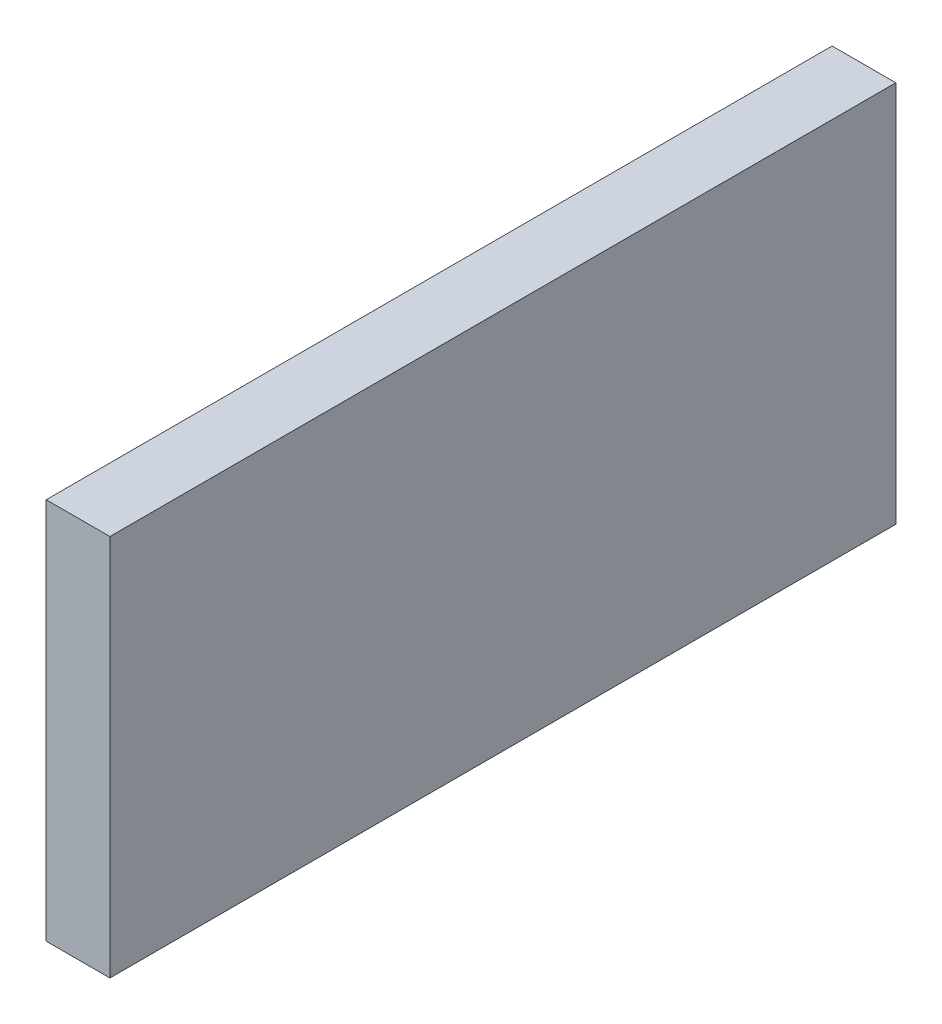
ISO-10303-21;
HEADER;
FILE_DESCRIPTION(('STEP AP214'),'2;1');
FILE_NAME('part.step','',(''),(''),'','','');
FILE_SCHEMA(('AUTOMOTIVE_DESIGN { 1 0 10303 214 1 1 1 1 }'));
ENDSEC;
DATA;
#1=APPLICATION_CONTEXT('core data for automotive mechanical design processes');
#2=APPLICATION_PROTOCOL_DEFINITION('international standard','automotive_design',2000,#1);
#3=PRODUCT_CONTEXT('',#1,'mechanical');
#4=PRODUCT('Part','Part','',(#3));
#5=PRODUCT_RELATED_PRODUCT_CATEGORY('part','',(#4));
#6=PRODUCT_DEFINITION_FORMATION('','',#4);
#7=PRODUCT_DEFINITION_CONTEXT('part definition',#1,'design');
#8=PRODUCT_DEFINITION('design','',#6,#7);
#9=PRODUCT_DEFINITION_SHAPE('','',#8);
#10=(LENGTH_UNIT() NAMED_UNIT(*) SI_UNIT(.MILLI.,.METRE.));
#11=(NAMED_UNIT(*) PLANE_ANGLE_UNIT() SI_UNIT($,.RADIAN.));
#12=(NAMED_UNIT(*) SI_UNIT($,.STERADIAN.) SOLID_ANGLE_UNIT());
#13=UNCERTAINTY_MEASURE_WITH_UNIT(LENGTH_MEASURE(1.E-05),#10,'distance_accuracy_value','');
#14=(GEOMETRIC_REPRESENTATION_CONTEXT(3) GLOBAL_UNCERTAINTY_ASSIGNED_CONTEXT((#13)) GLOBAL_UNIT_ASSIGNED_CONTEXT((#10,
#11,#12)) REPRESENTATION_CONTEXT('',''));
#15=CARTESIAN_POINT('',(0.,0.,0.));
#16=DIRECTION('',(0.,0.,1.));
#17=DIRECTION('',(1.,0.,0.));
#18=AXIS2_PLACEMENT_3D('',#15,#16,#17);
#19=CARTESIAN_POINT('',(0.,18.,0.));
#20=DIRECTION('',(1.,0.,0.));
#21=DIRECTION('',(0.,0.,-1.));
#22=AXIS2_PLACEMENT_3D('',#19,#20,#21);
#23=PLANE('',#22);
#24=DIRECTION('',(0.,0.,1.));
#25=VECTOR('',#24,1.);
#26=CARTESIAN_POINT('',(0.,0.,0.));
#27=LINE('',#26,#25);
#28=CARTESIAN_POINT('',(0.,0.,-37.));
#29=VERTEX_POINT('',#28);
#30=CARTESIAN_POINT('',(0.,0.,0.));
#31=VERTEX_POINT('',#30);
#32=EDGE_CURVE('E96',#29,#31,#27,.T.);
#33=ORIENTED_EDGE('',*,*,#32,.T.);
#34=DIRECTION('',(0.,-1.,0.));
#35=VECTOR('',#34,1.);
#36=CARTESIAN_POINT('',(0.,18.,0.));
#37=LINE('',#36,#35);
#38=CARTESIAN_POINT('',(0.,18.,0.));
#39=VERTEX_POINT('',#38);
#40=EDGE_CURVE('E11',#39,#31,#37,.T.);
#41=ORIENTED_EDGE('',*,*,#40,.F.);
#42=DIRECTION('',(0.,0.,1.));
#43=VECTOR('',#42,1.);
#44=CARTESIAN_POINT('',(0.,18.,0.));
#45=LINE('',#44,#43);
#46=CARTESIAN_POINT('',(0.,18.,-37.));
#47=VERTEX_POINT('',#46);
#48=EDGE_CURVE('E84',#47,#39,#45,.T.);
#49=ORIENTED_EDGE('',*,*,#48,.F.);
#50=DIRECTION('',(0.,-1.,0.));
#51=VECTOR('',#50,1.);
#52=CARTESIAN_POINT('',(0.,18.,-37.));
#53=LINE('',#52,#51);
#54=EDGE_CURVE('E92',#47,#29,#53,.T.);
#55=ORIENTED_EDGE('',*,*,#54,.T.);
#56=EDGE_LOOP('',(#33,#41,#49,#55));
#57=FACE_BOUND('',#56,.T.);
#58=ADVANCED_FACE('F33',(#57),#23,.F.);
#59=CARTESIAN_POINT('',(0.,18.,0.));
#60=DIRECTION('',(0.,0.,-1.));
#61=DIRECTION('',(-1.,0.,0.));
#62=AXIS2_PLACEMENT_3D('',#59,#60,#61);
#63=PLANE('',#62);
#64=DIRECTION('',(1.,0.,0.));
#65=VECTOR('',#64,1.);
#66=CARTESIAN_POINT('',(0.,0.,0.));
#67=LINE('',#66,#65);
#68=CARTESIAN_POINT('',(3.,0.,0.));
#69=VERTEX_POINT('',#68);
#70=EDGE_CURVE('E88',#31,#69,#67,.T.);
#71=ORIENTED_EDGE('',*,*,#70,.T.);
#72=DIRECTION('',(0.,-1.,0.));
#73=VECTOR('',#72,1.);
#74=CARTESIAN_POINT('',(3.,18.,0.));
#75=LINE('',#74,#73);
#76=CARTESIAN_POINT('',(3.,18.,0.));
#77=VERTEX_POINT('',#76);
#78=EDGE_CURVE('E41',#77,#69,#75,.T.);
#79=ORIENTED_EDGE('',*,*,#78,.F.);
#80=DIRECTION('',(1.,0.,0.));
#81=VECTOR('',#80,1.);
#82=CARTESIAN_POINT('',(0.,18.,0.));
#83=LINE('',#82,#81);
#84=EDGE_CURVE('E79',#39,#77,#83,.T.);
#85=ORIENTED_EDGE('',*,*,#84,.F.);
#86=ORIENTED_EDGE('',*,*,#40,.T.);
#87=EDGE_LOOP('',(#71,#79,#85,#86));
#88=FACE_BOUND('',#87,.T.);
#89=ADVANCED_FACE('F87',(#88),#63,.F.);
#90=CARTESIAN_POINT('',(3.,18.,0.));
#91=DIRECTION('',(-1.,0.,0.));
#92=DIRECTION('',(0.,0.,1.));
#93=AXIS2_PLACEMENT_3D('',#90,#91,#92);
#94=PLANE('',#93);
#95=DIRECTION('',(0.,0.,-1.));
#96=VECTOR('',#95,1.);
#97=CARTESIAN_POINT('',(3.,0.,0.));
#98=LINE('',#97,#96);
#99=CARTESIAN_POINT('',(3.,0.,-37.));
#100=VERTEX_POINT('',#99);
#101=EDGE_CURVE('E66',#69,#100,#98,.T.);
#102=ORIENTED_EDGE('',*,*,#101,.T.);
#103=DIRECTION('',(0.,-1.,0.));
#104=VECTOR('',#103,1.);
#105=CARTESIAN_POINT('',(3.,18.,-37.));
#106=LINE('',#105,#104);
#107=CARTESIAN_POINT('',(3.,18.,-37.));
#108=VERTEX_POINT('',#107);
#109=EDGE_CURVE('E89',#108,#100,#106,.T.);
#110=ORIENTED_EDGE('',*,*,#109,.F.);
#111=DIRECTION('',(0.,0.,-1.));
#112=VECTOR('',#111,1.);
#113=CARTESIAN_POINT('',(3.,18.,0.));
#114=LINE('',#113,#112);
#115=EDGE_CURVE('E82',#77,#108,#114,.T.);
#116=ORIENTED_EDGE('',*,*,#115,.F.);
#117=ORIENTED_EDGE('',*,*,#78,.T.);
#118=EDGE_LOOP('',(#102,#110,#116,#117));
#119=FACE_BOUND('',#118,.T.);
#120=ADVANCED_FACE('F90',(#119),#94,.F.);
#121=CARTESIAN_POINT('',(0.,18.,-37.));
#122=DIRECTION('',(0.,0.,1.));
#123=DIRECTION('',(1.,0.,0.));
#124=AXIS2_PLACEMENT_3D('',#121,#122,#123);
#125=PLANE('',#124);
#126=DIRECTION('',(-1.,0.,0.));
#127=VECTOR('',#126,1.);
#128=CARTESIAN_POINT('',(0.,0.,-37.));
#129=LINE('',#128,#127);
#130=EDGE_CURVE('E72',#100,#29,#129,.T.);
#131=ORIENTED_EDGE('',*,*,#130,.T.);
#132=ORIENTED_EDGE('',*,*,#54,.F.);
#133=DIRECTION('',(-1.,0.,0.));
#134=VECTOR('',#133,1.);
#135=CARTESIAN_POINT('',(0.,18.,-37.));
#136=LINE('',#135,#134);
#137=EDGE_CURVE('E49',#108,#47,#136,.T.);
#138=ORIENTED_EDGE('',*,*,#137,.F.);
#139=ORIENTED_EDGE('',*,*,#109,.T.);
#140=EDGE_LOOP('',(#131,#132,#138,#139));
#141=FACE_BOUND('',#140,.T.);
#142=ADVANCED_FACE('F103',(#141),#125,.F.);
#143=CARTESIAN_POINT('',(0.,18.,0.));
#144=DIRECTION('',(0.,-1.,0.));
#145=DIRECTION('',(0.,0.,-1.));
#146=AXIS2_PLACEMENT_3D('',#143,#144,#145);
#147=PLANE('',#146);
#148=ORIENTED_EDGE('',*,*,#48,.T.);
#149=ORIENTED_EDGE('',*,*,#84,.T.);
#150=ORIENTED_EDGE('',*,*,#115,.T.);
#151=ORIENTED_EDGE('',*,*,#137,.T.);
#152=EDGE_LOOP('',(#148,#149,#150,#151));
#153=FACE_BOUND('',#152,.T.);
#154=ADVANCED_FACE('F80',(#153),#147,.F.);
#155=CARTESIAN_POINT('',(0.,0.,0.));
#156=DIRECTION('',(0.,-1.,0.));
#157=DIRECTION('',(0.,0.,-1.));
#158=AXIS2_PLACEMENT_3D('',#155,#156,#157);
#159=PLANE('',#158);
#160=ORIENTED_EDGE('',*,*,#32,.F.);
#161=ORIENTED_EDGE('',*,*,#130,.F.);
#162=ORIENTED_EDGE('',*,*,#101,.F.);
#163=ORIENTED_EDGE('',*,*,#70,.F.);
#164=EDGE_LOOP('',(#160,#161,#162,#163));
#165=FACE_BOUND('',#164,.T.);
#166=ADVANCED_FACE('F106',(#165),#159,.T.);
#167=CLOSED_SHELL('',(#58,#89,#120,#142,#154,#166));
#168=MANIFOLD_SOLID_BREP('B2',#167);
#169=ADVANCED_BREP_SHAPE_REPRESENTATION('',(#18,#168),#14);
#170=SHAPE_DEFINITION_REPRESENTATION(#9,#169);
ENDSEC;
END-ISO-10303-21;
